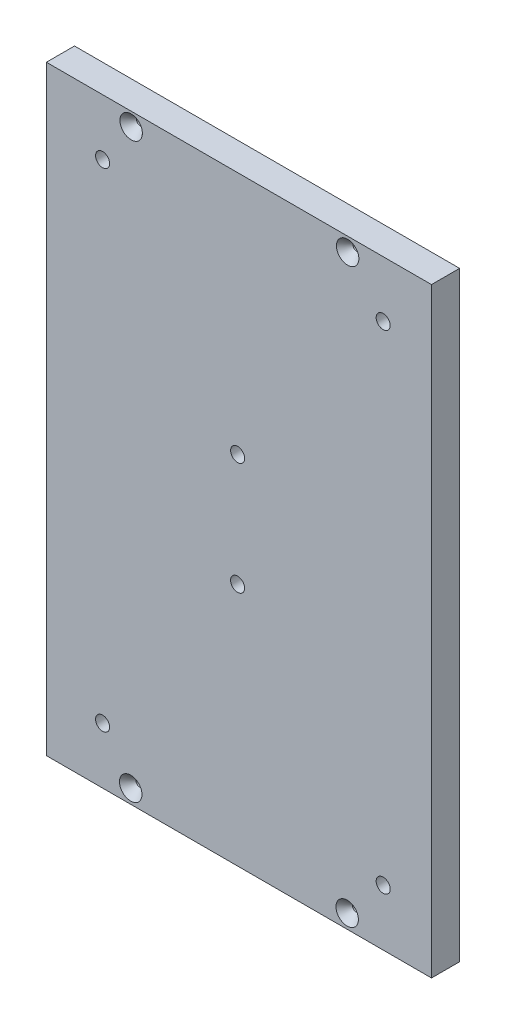
ISO-10303-21;
HEADER;
FILE_DESCRIPTION(('STEP AP214'),'2;1');
FILE_NAME('part.step','',(''),(''),'','','');
FILE_SCHEMA(('AUTOMOTIVE_DESIGN { 1 0 10303 214 1 1 1 1 }'));
ENDSEC;
DATA;
#1=APPLICATION_CONTEXT('core data for automotive mechanical design processes');
#2=APPLICATION_PROTOCOL_DEFINITION('international standard','automotive_design',2000,#1);
#3=PRODUCT_CONTEXT('',#1,'mechanical');
#4=PRODUCT('Part','Part','',(#3));
#5=PRODUCT_RELATED_PRODUCT_CATEGORY('part','',(#4));
#6=PRODUCT_DEFINITION_FORMATION('','',#4);
#7=PRODUCT_DEFINITION_CONTEXT('part definition',#1,'design');
#8=PRODUCT_DEFINITION('design','',#6,#7);
#9=PRODUCT_DEFINITION_SHAPE('','',#8);
#10=(LENGTH_UNIT() NAMED_UNIT(*) SI_UNIT(.MILLI.,.METRE.));
#11=(NAMED_UNIT(*) PLANE_ANGLE_UNIT() SI_UNIT($,.RADIAN.));
#12=(NAMED_UNIT(*) SI_UNIT($,.STERADIAN.) SOLID_ANGLE_UNIT());
#13=UNCERTAINTY_MEASURE_WITH_UNIT(LENGTH_MEASURE(1.E-05),#10,'distance_accuracy_value','');
#14=(GEOMETRIC_REPRESENTATION_CONTEXT(3) GLOBAL_UNCERTAINTY_ASSIGNED_CONTEXT((#13)) GLOBAL_UNIT_ASSIGNED_CONTEXT((#10,
#11,#12)) REPRESENTATION_CONTEXT('',''));
#15=CARTESIAN_POINT('',(0.,0.,0.));
#16=DIRECTION('',(0.,0.,1.));
#17=DIRECTION('',(1.,0.,0.));
#18=AXIS2_PLACEMENT_3D('',#15,#16,#17);
#19=CARTESIAN_POINT('',(125.242491642911,0.,12.7));
#20=DIRECTION('',(1.,0.,0.));
#21=DIRECTION('',(0.,0.,-1.));
#22=AXIS2_PLACEMENT_3D('',#19,#20,#21);
#23=PLANE('',#22);
#24=DIRECTION('',(0.,-1.,0.));
#25=VECTOR('',#24,1.);
#26=CARTESIAN_POINT('',(125.242491642911,0.,0.));
#27=LINE('',#26,#25);
#28=CARTESIAN_POINT('',(125.242491642911,271.365530146065,0.));
#29=VERTEX_POINT('',#28);
#30=CARTESIAN_POINT('',(125.242491642911,0.,0.));
#31=VERTEX_POINT('',#30);
#32=EDGE_CURVE('E100',#29,#31,#27,.T.);
#33=ORIENTED_EDGE('',*,*,#32,.T.);
#34=DIRECTION('',(0.,0.,-1.));
#35=VECTOR('',#34,1.);
#36=CARTESIAN_POINT('',(125.242491642911,0.,12.7));
#37=LINE('',#36,#35);
#38=CARTESIAN_POINT('',(125.242491642911,0.,12.7));
#39=VERTEX_POINT('',#38);
#40=EDGE_CURVE('E11',#39,#31,#37,.T.);
#41=ORIENTED_EDGE('',*,*,#40,.F.);
#42=DIRECTION('',(0.,-1.,0.));
#43=VECTOR('',#42,1.);
#44=CARTESIAN_POINT('',(125.242491642911,0.,12.7));
#45=LINE('',#44,#43);
#46=CARTESIAN_POINT('',(125.242491642911,271.365530146065,12.7));
#47=VERTEX_POINT('',#46);
#48=EDGE_CURVE('E87',#47,#39,#45,.T.);
#49=ORIENTED_EDGE('',*,*,#48,.F.);
#50=DIRECTION('',(0.,0.,-1.));
#51=VECTOR('',#50,1.);
#52=CARTESIAN_POINT('',(125.242491642911,271.365530146065,12.7));
#53=LINE('',#52,#51);
#54=EDGE_CURVE('E96',#47,#29,#53,.T.);
#55=ORIENTED_EDGE('',*,*,#54,.T.);
#56=EDGE_LOOP('',(#33,#41,#49,#55));
#57=FACE_BOUND('',#56,.T.);
#58=ADVANCED_FACE('F34',(#57),#23,.F.);
#59=CARTESIAN_POINT('',(125.242491642911,0.,12.7));
#60=DIRECTION('',(0.,1.,0.));
#61=DIRECTION('',(0.,0.,1.));
#62=AXIS2_PLACEMENT_3D('',#59,#60,#61);
#63=PLANE('',#62);
#64=DIRECTION('',(1.,0.,0.));
#65=VECTOR('',#64,1.);
#66=CARTESIAN_POINT('',(125.242491642911,0.,0.));
#67=LINE('',#66,#65);
#68=CARTESIAN_POINT('',(299.263797608764,0.,0.));
#69=VERTEX_POINT('',#68);
#70=EDGE_CURVE('E91',#31,#69,#67,.T.);
#71=ORIENTED_EDGE('',*,*,#70,.T.);
#72=DIRECTION('',(0.,0.,-1.));
#73=VECTOR('',#72,1.);
#74=CARTESIAN_POINT('',(299.263797608764,0.,12.7));
#75=LINE('',#74,#73);
#76=CARTESIAN_POINT('',(299.263797608764,0.,12.7));
#77=VERTEX_POINT('',#76);
#78=EDGE_CURVE('E43',#77,#69,#75,.T.);
#79=ORIENTED_EDGE('',*,*,#78,.F.);
#80=DIRECTION('',(1.,0.,0.));
#81=VECTOR('',#80,1.);
#82=CARTESIAN_POINT('',(125.242491642911,0.,12.7));
#83=LINE('',#82,#81);
#84=EDGE_CURVE('E82',#39,#77,#83,.T.);
#85=ORIENTED_EDGE('',*,*,#84,.F.);
#86=ORIENTED_EDGE('',*,*,#40,.T.);
#87=EDGE_LOOP('',(#71,#79,#85,#86));
#88=FACE_BOUND('',#87,.T.);
#89=ADVANCED_FACE('F90',(#88),#63,.F.);
#90=CARTESIAN_POINT('',(299.263797608764,0.,12.7));
#91=DIRECTION('',(-1.,0.,0.));
#92=DIRECTION('',(0.,-1.,0.));
#93=AXIS2_PLACEMENT_3D('',#90,#91,#92);
#94=PLANE('',#93);
#95=DIRECTION('',(0.,1.,0.));
#96=VECTOR('',#95,1.);
#97=CARTESIAN_POINT('',(299.263797608764,0.,0.));
#98=LINE('',#97,#96);
#99=CARTESIAN_POINT('',(299.263797608764,271.365530146065,0.));
#100=VERTEX_POINT('',#99);
#101=EDGE_CURVE('E69',#69,#100,#98,.T.);
#102=ORIENTED_EDGE('',*,*,#101,.T.);
#103=DIRECTION('',(0.,0.,-1.));
#104=VECTOR('',#103,1.);
#105=CARTESIAN_POINT('',(299.263797608764,271.365530146065,12.7));
#106=LINE('',#105,#104);
#107=CARTESIAN_POINT('',(299.263797608764,271.365530146065,12.7));
#108=VERTEX_POINT('',#107);
#109=EDGE_CURVE('E92',#108,#100,#106,.T.);
#110=ORIENTED_EDGE('',*,*,#109,.F.);
#111=DIRECTION('',(0.,1.,0.));
#112=VECTOR('',#111,1.);
#113=CARTESIAN_POINT('',(299.263797608764,0.,12.7));
#114=LINE('',#113,#112);
#115=EDGE_CURVE('E85',#77,#108,#114,.T.);
#116=ORIENTED_EDGE('',*,*,#115,.F.);
#117=ORIENTED_EDGE('',*,*,#78,.T.);
#118=EDGE_LOOP('',(#102,#110,#116,#117));
#119=FACE_BOUND('',#118,.T.);
#120=ADVANCED_FACE('F94',(#119),#94,.F.);
#121=CARTESIAN_POINT('',(125.242491642911,271.365530146065,12.7));
#122=DIRECTION('',(0.,-1.,0.));
#123=DIRECTION('',(1.,0.,0.));
#124=AXIS2_PLACEMENT_3D('',#121,#122,#123);
#125=PLANE('',#124);
#126=DIRECTION('',(-1.,0.,0.));
#127=VECTOR('',#126,1.);
#128=CARTESIAN_POINT('',(125.242491642911,271.365530146065,0.));
#129=LINE('',#128,#127);
#130=EDGE_CURVE('E75',#100,#29,#129,.T.);
#131=ORIENTED_EDGE('',*,*,#130,.T.);
#132=ORIENTED_EDGE('',*,*,#54,.F.);
#133=DIRECTION('',(-1.,0.,0.));
#134=VECTOR('',#133,1.);
#135=CARTESIAN_POINT('',(125.242491642911,271.365530146065,12.7));
#136=LINE('',#135,#134);
#137=EDGE_CURVE('E52',#108,#47,#136,.T.);
#138=ORIENTED_EDGE('',*,*,#137,.F.);
#139=ORIENTED_EDGE('',*,*,#109,.T.);
#140=EDGE_LOOP('',(#131,#132,#138,#139));
#141=FACE_BOUND('',#140,.T.);
#142=ADVANCED_FACE('F191',(#141),#125,.F.);
#143=CARTESIAN_POINT('',(0.,0.,12.7));
#144=DIRECTION('',(0.,0.,-1.));
#145=DIRECTION('',(-1.,0.,0.));
#146=AXIS2_PLACEMENT_3D('',#143,#144,#145);
#147=PLANE('',#146);
#148=CARTESIAN_POINT('',(163.342491642911,6.35000000000024,12.7000000000335));
#149=DIRECTION('',(0.,0.,1.));
#150=DIRECTION('',(1.,0.,0.));
#151=AXIS2_PLACEMENT_3D('',#148,#149,#150);
#152=CIRCLE('',#151,5.08);
#153=CARTESIAN_POINT('',(168.422491642911,6.35000000000024,12.7000000000335));
#154=VERTEX_POINT('',#153);
#155=EDGE_CURVE('E371',#154,#154,#152,.T.);
#156=ORIENTED_EDGE('',*,*,#155,.F.);
#157=EDGE_LOOP('',(#156));
#158=FACE_BOUND('',#157,.T.);
#159=CARTESIAN_POINT('',(261.163797608764,6.35000000000027,12.7000000000335));
#160=DIRECTION('',(0.,0.,1.));
#161=DIRECTION('',(1.,0.,0.));
#162=AXIS2_PLACEMENT_3D('',#159,#160,#161);
#163=CIRCLE('',#162,5.08000000000003);
#164=CARTESIAN_POINT('',(266.243797608764,6.35000000000027,12.7000000000335));
#165=VERTEX_POINT('',#164);
#166=EDGE_CURVE('E127',#165,#165,#163,.T.);
#167=ORIENTED_EDGE('',*,*,#166,.F.);
#168=EDGE_LOOP('',(#167));
#169=FACE_BOUND('',#168,.T.);
#170=CARTESIAN_POINT('',(163.542078970857,265.224961390961,12.7000000000335));
#171=DIRECTION('',(0.,0.,1.));
#172=DIRECTION('',(1.,0.,0.));
#173=AXIS2_PLACEMENT_3D('',#170,#171,#172);
#174=CIRCLE('',#173,5.08);
#175=CARTESIAN_POINT('',(168.622078970857,265.224961390961,12.7000000000335));
#176=VERTEX_POINT('',#175);
#177=EDGE_CURVE('E120',#176,#176,#174,.T.);
#178=ORIENTED_EDGE('',*,*,#177,.F.);
#179=EDGE_LOOP('',(#178));
#180=FACE_BOUND('',#179,.T.);
#181=CARTESIAN_POINT('',(261.363268644928,265.074125007527,12.7000000000335));
#182=DIRECTION('',(0.,0.,1.));
#183=DIRECTION('',(1.,0.,0.));
#184=AXIS2_PLACEMENT_3D('',#181,#182,#183);
#185=CIRCLE('',#184,5.08000000000003);
#186=CARTESIAN_POINT('',(266.443268644928,265.074125007527,12.7000000000335));
#187=VERTEX_POINT('',#186);
#188=EDGE_CURVE('E116',#187,#187,#185,.T.);
#189=ORIENTED_EDGE('',*,*,#188,.F.);
#190=EDGE_LOOP('',(#189));
#191=FACE_BOUND('',#190,.T.);
#192=CARTESIAN_POINT('',(277.426568304688,245.965530146065,12.7));
#193=DIRECTION('',(0.,0.,-1.));
#194=DIRECTION('',(-1.,0.,0.));
#195=AXIS2_PLACEMENT_3D('',#192,#193,#194);
#196=CIRCLE('',#195,3.17499999999998);
#197=CARTESIAN_POINT('',(274.251568304688,245.965530146065,12.7));
#198=VERTEX_POINT('',#197);
#199=EDGE_CURVE('E143',#198,#198,#196,.T.);
#200=ORIENTED_EDGE('',*,*,#199,.T.);
#201=EDGE_LOOP('',(#200));
#202=FACE_BOUND('',#201,.T.);
#203=CARTESIAN_POINT('',(211.65326417621,161.082765073034,12.7));
#204=DIRECTION('',(0.,0.,-1.));
#205=DIRECTION('',(-1.,0.,0.));
#206=AXIS2_PLACEMENT_3D('',#203,#204,#205);
#207=CIRCLE('',#206,3.17499999999998);
#208=CARTESIAN_POINT('',(208.47826417621,161.082765073034,12.7));
#209=VERTEX_POINT('',#208);
#210=EDGE_CURVE('E149',#209,#209,#207,.T.);
#211=ORIENTED_EDGE('',*,*,#210,.T.);
#212=EDGE_LOOP('',(#211));
#213=FACE_BOUND('',#212,.T.);
#214=CARTESIAN_POINT('',(150.642491642911,245.965530146065,12.7));
#215=DIRECTION('',(0.,0.,-1.));
#216=DIRECTION('',(-1.,0.,0.));
#217=AXIS2_PLACEMENT_3D('',#214,#215,#216);
#218=CIRCLE('',#217,3.17499999999998);
#219=CARTESIAN_POINT('',(147.467491642911,245.965530146065,12.7));
#220=VERTEX_POINT('',#219);
#221=EDGE_CURVE('E155',#220,#220,#218,.T.);
#222=ORIENTED_EDGE('',*,*,#221,.T.);
#223=EDGE_LOOP('',(#222));
#224=FACE_BOUND('',#223,.T.);
#225=CARTESIAN_POINT('',(211.653264176209,110.282765073031,12.7));
#226=DIRECTION('',(0.,0.,-1.));
#227=DIRECTION('',(-1.,0.,0.));
#228=AXIS2_PLACEMENT_3D('',#225,#226,#227);
#229=CIRCLE('',#228,3.17499999999998);
#230=CARTESIAN_POINT('',(208.478264176209,110.282765073031,12.7));
#231=VERTEX_POINT('',#230);
#232=EDGE_CURVE('E161',#231,#231,#229,.T.);
#233=ORIENTED_EDGE('',*,*,#232,.T.);
#234=EDGE_LOOP('',(#233));
#235=FACE_BOUND('',#234,.T.);
#236=CARTESIAN_POINT('',(277.426568304688,25.4000000000031,12.7));
#237=DIRECTION('',(0.,0.,-1.));
#238=DIRECTION('',(-1.,0.,0.));
#239=AXIS2_PLACEMENT_3D('',#236,#237,#238);
#240=CIRCLE('',#239,3.17499999999998);
#241=CARTESIAN_POINT('',(274.251568304688,25.4000000000031,12.7));
#242=VERTEX_POINT('',#241);
#243=EDGE_CURVE('E167',#242,#242,#240,.T.);
#244=ORIENTED_EDGE('',*,*,#243,.T.);
#245=EDGE_LOOP('',(#244));
#246=FACE_BOUND('',#245,.T.);
#247=CARTESIAN_POINT('',(150.642491642911,25.4000000000031,12.7));
#248=DIRECTION('',(0.,0.,-1.));
#249=DIRECTION('',(-1.,0.,0.));
#250=AXIS2_PLACEMENT_3D('',#247,#248,#249);
#251=CIRCLE('',#250,3.17499999999998);
#252=CARTESIAN_POINT('',(147.467491642911,25.4000000000031,12.7));
#253=VERTEX_POINT('',#252);
#254=EDGE_CURVE('E103',#253,#253,#251,.T.);
#255=ORIENTED_EDGE('',*,*,#254,.T.);
#256=EDGE_LOOP('',(#255));
#257=FACE_BOUND('',#256,.T.);
#258=ORIENTED_EDGE('',*,*,#48,.T.);
#259=ORIENTED_EDGE('',*,*,#84,.T.);
#260=ORIENTED_EDGE('',*,*,#115,.T.);
#261=ORIENTED_EDGE('',*,*,#137,.T.);
#262=EDGE_LOOP('',(#258,#259,#260,#261));
#263=FACE_BOUND('',#262,.T.);
#264=ADVANCED_FACE('F83',(#158,#169,#180,#191,#202,#213,#224,#235,#246,#257,#263),#147,.F.);
#265=CARTESIAN_POINT('',(0.,0.,0.));
#266=DIRECTION('',(0.,0.,-1.));
#267=DIRECTION('',(-1.,0.,0.));
#268=AXIS2_PLACEMENT_3D('',#265,#266,#267);
#269=PLANE('',#268);
#270=CARTESIAN_POINT('',(163.342491642911,6.35000000000024,0.));
#271=DIRECTION('',(0.,0.,-1.));
#272=DIRECTION('',(-1.,0.,0.));
#273=AXIS2_PLACEMENT_3D('',#270,#271,#272);
#274=CIRCLE('',#273,1.58749999999999);
#275=CARTESIAN_POINT('',(161.754991642911,6.35000000000024,0.));
#276=VERTEX_POINT('',#275);
#277=EDGE_CURVE('E37',#276,#276,#274,.T.);
#278=ORIENTED_EDGE('',*,*,#277,.F.);
#279=EDGE_LOOP('',(#278));
#280=FACE_BOUND('',#279,.T.);
#281=CARTESIAN_POINT('',(261.163797608764,6.35000000000027,0.));
#282=DIRECTION('',(0.,0.,-1.));
#283=DIRECTION('',(-1.,0.,0.));
#284=AXIS2_PLACEMENT_3D('',#281,#282,#283);
#285=CIRCLE('',#284,1.58750000000002);
#286=CARTESIAN_POINT('',(259.576297608764,6.35000000000027,0.));
#287=VERTEX_POINT('',#286);
#288=EDGE_CURVE('E118',#287,#287,#285,.T.);
#289=ORIENTED_EDGE('',*,*,#288,.F.);
#290=EDGE_LOOP('',(#289));
#291=FACE_BOUND('',#290,.T.);
#292=CARTESIAN_POINT('',(163.542078970857,265.224961390961,0.));
#293=DIRECTION('',(0.,0.,-1.));
#294=DIRECTION('',(-1.,0.,0.));
#295=AXIS2_PLACEMENT_3D('',#292,#293,#294);
#296=CIRCLE('',#295,1.58749999999999);
#297=CARTESIAN_POINT('',(161.954578970857,265.224961390961,0.));
#298=VERTEX_POINT('',#297);
#299=EDGE_CURVE('E114',#298,#298,#296,.T.);
#300=ORIENTED_EDGE('',*,*,#299,.F.);
#301=EDGE_LOOP('',(#300));
#302=FACE_BOUND('',#301,.T.);
#303=CARTESIAN_POINT('',(261.363268644928,265.074125007527,0.));
#304=DIRECTION('',(0.,0.,-1.));
#305=DIRECTION('',(-1.,0.,0.));
#306=AXIS2_PLACEMENT_3D('',#303,#304,#305);
#307=CIRCLE('',#306,1.58750000000002);
#308=CARTESIAN_POINT('',(259.775768644928,265.074125007527,0.));
#309=VERTEX_POINT('',#308);
#310=EDGE_CURVE('E109',#309,#309,#307,.T.);
#311=ORIENTED_EDGE('',*,*,#310,.F.);
#312=EDGE_LOOP('',(#311));
#313=FACE_BOUND('',#312,.T.);
#314=CARTESIAN_POINT('',(277.426568304688,245.965530146065,0.));
#315=DIRECTION('',(0.,0.,-1.));
#316=DIRECTION('',(-1.,0.,0.));
#317=AXIS2_PLACEMENT_3D('',#314,#315,#316);
#318=CIRCLE('',#317,3.17499999999998);
#319=CARTESIAN_POINT('',(274.251568304688,245.965530146065,0.));
#320=VERTEX_POINT('',#319);
#321=EDGE_CURVE('E112',#320,#320,#318,.T.);
#322=ORIENTED_EDGE('',*,*,#321,.F.);
#323=EDGE_LOOP('',(#322));
#324=FACE_BOUND('',#323,.T.);
#325=CARTESIAN_POINT('',(211.65326417621,161.082765073034,0.));
#326=DIRECTION('',(0.,0.,-1.));
#327=DIRECTION('',(-1.,0.,0.));
#328=AXIS2_PLACEMENT_3D('',#325,#326,#327);
#329=CIRCLE('',#328,3.17499999999998);
#330=CARTESIAN_POINT('',(208.47826417621,161.082765073034,0.));
#331=VERTEX_POINT('',#330);
#332=EDGE_CURVE('E146',#331,#331,#329,.T.);
#333=ORIENTED_EDGE('',*,*,#332,.F.);
#334=EDGE_LOOP('',(#333));
#335=FACE_BOUND('',#334,.T.);
#336=CARTESIAN_POINT('',(150.642491642911,245.965530146065,0.));
#337=DIRECTION('',(0.,0.,-1.));
#338=DIRECTION('',(-1.,0.,0.));
#339=AXIS2_PLACEMENT_3D('',#336,#337,#338);
#340=CIRCLE('',#339,3.17499999999998);
#341=CARTESIAN_POINT('',(147.467491642911,245.965530146065,0.));
#342=VERTEX_POINT('',#341);
#343=EDGE_CURVE('E152',#342,#342,#340,.T.);
#344=ORIENTED_EDGE('',*,*,#343,.F.);
#345=EDGE_LOOP('',(#344));
#346=FACE_BOUND('',#345,.T.);
#347=CARTESIAN_POINT('',(211.653264176209,110.282765073031,0.));
#348=DIRECTION('',(0.,0.,-1.));
#349=DIRECTION('',(-1.,0.,0.));
#350=AXIS2_PLACEMENT_3D('',#347,#348,#349);
#351=CIRCLE('',#350,3.17499999999998);
#352=CARTESIAN_POINT('',(208.478264176209,110.282765073031,0.));
#353=VERTEX_POINT('',#352);
#354=EDGE_CURVE('E158',#353,#353,#351,.T.);
#355=ORIENTED_EDGE('',*,*,#354,.F.);
#356=EDGE_LOOP('',(#355));
#357=FACE_BOUND('',#356,.T.);
#358=CARTESIAN_POINT('',(277.426568304688,25.4000000000031,0.));
#359=DIRECTION('',(0.,0.,-1.));
#360=DIRECTION('',(-1.,0.,0.));
#361=AXIS2_PLACEMENT_3D('',#358,#359,#360);
#362=CIRCLE('',#361,3.17499999999998);
#363=CARTESIAN_POINT('',(274.251568304688,25.4000000000031,0.));
#364=VERTEX_POINT('',#363);
#365=EDGE_CURVE('E164',#364,#364,#362,.T.);
#366=ORIENTED_EDGE('',*,*,#365,.F.);
#367=EDGE_LOOP('',(#366));
#368=FACE_BOUND('',#367,.T.);
#369=CARTESIAN_POINT('',(150.642491642911,25.4000000000031,0.));
#370=DIRECTION('',(0.,0.,-1.));
#371=DIRECTION('',(-1.,0.,0.));
#372=AXIS2_PLACEMENT_3D('',#369,#370,#371);
#373=CIRCLE('',#372,3.17499999999998);
#374=CARTESIAN_POINT('',(147.467491642911,25.4000000000031,0.));
#375=VERTEX_POINT('',#374);
#376=EDGE_CURVE('E170',#375,#375,#373,.T.);
#377=ORIENTED_EDGE('',*,*,#376,.F.);
#378=EDGE_LOOP('',(#377));
#379=FACE_BOUND('',#378,.T.);
#380=ORIENTED_EDGE('',*,*,#32,.F.);
#381=ORIENTED_EDGE('',*,*,#130,.F.);
#382=ORIENTED_EDGE('',*,*,#101,.F.);
#383=ORIENTED_EDGE('',*,*,#70,.F.);
#384=EDGE_LOOP('',(#380,#381,#382,#383));
#385=FACE_BOUND('',#384,.T.);
#386=ADVANCED_FACE('F181',(#280,#291,#302,#313,#324,#335,#346,#357,#368,#379,#385),#269,.T.);
#387=CARTESIAN_POINT('',(150.642491642911,25.4000000000031,0.));
#388=DIRECTION('',(0.,0.,-1.));
#389=DIRECTION('',(-1.,0.,0.));
#390=AXIS2_PLACEMENT_3D('',#387,#388,#389);
#391=CYLINDRICAL_SURFACE('',#390,3.17499999999998);
#392=ORIENTED_EDGE('',*,*,#254,.F.);
#393=EDGE_LOOP('',(#392));
#394=FACE_BOUND('',#393,.T.);
#395=ORIENTED_EDGE('',*,*,#376,.T.);
#396=EDGE_LOOP('',(#395));
#397=FACE_BOUND('',#396,.T.);
#398=ADVANCED_FACE('F177',(#394,#397),#391,.F.);
#399=CARTESIAN_POINT('',(277.426568304688,25.4000000000031,0.));
#400=DIRECTION('',(0.,0.,-1.));
#401=DIRECTION('',(-1.,0.,0.));
#402=AXIS2_PLACEMENT_3D('',#399,#400,#401);
#403=CYLINDRICAL_SURFACE('',#402,3.17499999999998);
#404=ORIENTED_EDGE('',*,*,#243,.F.);
#405=EDGE_LOOP('',(#404));
#406=FACE_BOUND('',#405,.T.);
#407=ORIENTED_EDGE('',*,*,#365,.T.);
#408=EDGE_LOOP('',(#407));
#409=FACE_BOUND('',#408,.T.);
#410=ADVANCED_FACE('F180',(#406,#409),#403,.F.);
#411=CARTESIAN_POINT('',(211.653264176209,110.282765073031,0.));
#412=DIRECTION('',(0.,0.,-1.));
#413=DIRECTION('',(-1.,0.,0.));
#414=AXIS2_PLACEMENT_3D('',#411,#412,#413);
#415=CYLINDRICAL_SURFACE('',#414,3.17499999999998);
#416=ORIENTED_EDGE('',*,*,#232,.F.);
#417=EDGE_LOOP('',(#416));
#418=FACE_BOUND('',#417,.T.);
#419=ORIENTED_EDGE('',*,*,#354,.T.);
#420=EDGE_LOOP('',(#419));
#421=FACE_BOUND('',#420,.T.);
#422=ADVANCED_FACE('F232',(#418,#421),#415,.F.);
#423=CARTESIAN_POINT('',(150.642491642911,245.965530146065,0.));
#424=DIRECTION('',(0.,0.,-1.));
#425=DIRECTION('',(-1.,0.,0.));
#426=AXIS2_PLACEMENT_3D('',#423,#424,#425);
#427=CYLINDRICAL_SURFACE('',#426,3.17499999999998);
#428=ORIENTED_EDGE('',*,*,#221,.F.);
#429=EDGE_LOOP('',(#428));
#430=FACE_BOUND('',#429,.T.);
#431=ORIENTED_EDGE('',*,*,#343,.T.);
#432=EDGE_LOOP('',(#431));
#433=FACE_BOUND('',#432,.T.);
#434=ADVANCED_FACE('F242',(#430,#433),#427,.F.);
#435=CARTESIAN_POINT('',(211.65326417621,161.082765073034,0.));
#436=DIRECTION('',(0.,0.,-1.));
#437=DIRECTION('',(-1.,0.,0.));
#438=AXIS2_PLACEMENT_3D('',#435,#436,#437);
#439=CYLINDRICAL_SURFACE('',#438,3.17499999999998);
#440=ORIENTED_EDGE('',*,*,#210,.F.);
#441=EDGE_LOOP('',(#440));
#442=FACE_BOUND('',#441,.T.);
#443=ORIENTED_EDGE('',*,*,#332,.T.);
#444=EDGE_LOOP('',(#443));
#445=FACE_BOUND('',#444,.T.);
#446=ADVANCED_FACE('F252',(#442,#445),#439,.F.);
#447=CARTESIAN_POINT('',(277.426568304688,245.965530146065,0.));
#448=DIRECTION('',(0.,0.,-1.));
#449=DIRECTION('',(-1.,0.,0.));
#450=AXIS2_PLACEMENT_3D('',#447,#448,#449);
#451=CYLINDRICAL_SURFACE('',#450,3.17499999999998);
#452=ORIENTED_EDGE('',*,*,#199,.F.);
#453=EDGE_LOOP('',(#452));
#454=FACE_BOUND('',#453,.T.);
#455=ORIENTED_EDGE('',*,*,#321,.T.);
#456=EDGE_LOOP('',(#455));
#457=FACE_BOUND('',#456,.T.);
#458=ADVANCED_FACE('F262',(#454,#457),#451,.F.);
#459=CARTESIAN_POINT('',(261.363268644928,265.074125007527,12.7000000000335));
#460=DIRECTION('',(0.,0.,1.));
#461=DIRECTION('',(1.,0.,0.));
#462=AXIS2_PLACEMENT_3D('',#459,#460,#461);
#463=CYLINDRICAL_SURFACE('',#462,1.58750000000002);
#464=ORIENTED_EDGE('',*,*,#310,.T.);
#465=EDGE_LOOP('',(#464));
#466=FACE_BOUND('',#465,.T.);
#467=CARTESIAN_POINT('',(261.363268644928,265.074125007527,8.6823383378141));
#468=DIRECTION('',(0.,0.,1.));
#469=DIRECTION('',(1.,0.,0.));
#470=AXIS2_PLACEMENT_3D('',#467,#468,#469);
#471=CIRCLE('',#470,1.58750000000002);
#472=CARTESIAN_POINT('',(262.950768644928,265.074125007527,8.6823383378141));
#473=VERTEX_POINT('',#472);
#474=EDGE_CURVE('E113',#473,#473,#471,.T.);
#475=ORIENTED_EDGE('',*,*,#474,.T.);
#476=EDGE_LOOP('',(#475));
#477=FACE_BOUND('',#476,.T.);
#478=ADVANCED_FACE('F272',(#466,#477),#463,.F.);
#479=CARTESIAN_POINT('',(261.363268644928,265.074125007527,12.7000000000335));
#480=DIRECTION('',(0.,0.,1.));
#481=DIRECTION('',(1.,0.,0.));
#482=AXIS2_PLACEMENT_3D('',#479,#480,#481);
#483=CONICAL_SURFACE('',#482,5.08000000000003,0.715584993317678);
#484=CARTESIAN_POINT('',(262.950768644928,265.074125007527,8.6823383378141));
#485=CARTESIAN_POINT('',(262.987148853261,265.074125007527,8.72418898012888));
#486=CARTESIAN_POINT('',(263.023529061595,265.074125007527,8.76603962244367));
#487=CARTESIAN_POINT('',(263.096289478261,265.074125007527,8.84974090707324));
#488=CARTESIAN_POINT('',(263.132669686595,265.074125007527,8.89159154938802));
#489=CARTESIAN_POINT('',(263.205430103261,265.074125007527,8.97529283401759));
#490=CARTESIAN_POINT('',(263.241810311595,265.074125007527,9.01714347633238));
#491=CARTESIAN_POINT('',(263.314570728261,265.074125007527,9.10084476096195));
#492=CARTESIAN_POINT('',(263.350950936595,265.074125007527,9.14269540327673));
#493=CARTESIAN_POINT('',(263.423711353261,265.074125007527,9.2263966879063));
#494=CARTESIAN_POINT('',(263.460091561595,265.074125007527,9.26824733022108));
#495=CARTESIAN_POINT('',(263.532851978261,265.074125007527,9.35194861485066));
#496=CARTESIAN_POINT('',(263.569232186595,265.074125007527,9.39379925716544));
#497=CARTESIAN_POINT('',(263.641992603261,265.074125007527,9.47750054179501));
#498=CARTESIAN_POINT('',(263.678372811595,265.074125007527,9.51935118410979));
#499=CARTESIAN_POINT('',(263.751133228261,265.074125007527,9.60305246873936));
#500=CARTESIAN_POINT('',(263.787513436595,265.074125007527,9.64490311105415));
#501=CARTESIAN_POINT('',(263.860273853261,265.074125007527,9.72860439568373));
#502=CARTESIAN_POINT('',(263.896654061595,265.074125007527,9.77045503799851));
#503=CARTESIAN_POINT('',(263.969414478261,265.074125007527,9.85415632262808));
#504=CARTESIAN_POINT('',(264.005794686595,265.074125007527,9.89600696494286));
#505=CARTESIAN_POINT('',(264.078555103261,265.074125007527,9.97970824957243));
#506=CARTESIAN_POINT('',(264.114935311595,265.074125007527,10.0215588918872));
#507=CARTESIAN_POINT('',(264.187695728261,265.074125007527,10.1052601765168));
#508=CARTESIAN_POINT('',(264.224075936595,265.074125007527,10.1471108188316));
#509=CARTESIAN_POINT('',(264.296836353261,265.074125007527,10.2308121034611));
#510=CARTESIAN_POINT('',(264.333216561595,265.074125007527,10.2726627457759));
#511=CARTESIAN_POINT('',(264.405976978261,265.074125007527,10.3563640304055));
#512=CARTESIAN_POINT('',(264.442357186595,265.074125007527,10.3982146727203));
#513=CARTESIAN_POINT('',(264.515117603261,265.074125007527,10.4819159573499));
#514=CARTESIAN_POINT('',(264.551497811595,265.074125007527,10.5237665996646));
#515=CARTESIAN_POINT('',(264.624258228261,265.074125007527,10.6074678842942));
#516=CARTESIAN_POINT('',(264.660638436595,265.074125007527,10.649318526609));
#517=CARTESIAN_POINT('',(264.733398853261,265.074125007527,10.7330198112386));
#518=CARTESIAN_POINT('',(264.769779061595,265.074125007527,10.7748704535533));
#519=CARTESIAN_POINT('',(264.842539478261,265.074125007527,10.8585717381829));
#520=CARTESIAN_POINT('',(264.878919686595,265.074125007527,10.9004223804977));
#521=CARTESIAN_POINT('',(264.951680103261,265.074125007527,10.9841236651273));
#522=CARTESIAN_POINT('',(264.988060311595,265.074125007527,11.0259743074421));
#523=CARTESIAN_POINT('',(265.060820728261,265.074125007527,11.1096755920716));
#524=CARTESIAN_POINT('',(265.097200936595,265.074125007527,11.1515262343864));
#525=CARTESIAN_POINT('',(265.169961353261,265.074125007527,11.235227519016));
#526=CARTESIAN_POINT('',(265.206341561595,265.074125007527,11.2770781613308));
#527=CARTESIAN_POINT('',(265.279101978261,265.074125007527,11.3607794459603));
#528=CARTESIAN_POINT('',(265.315482186595,265.074125007527,11.4026300882751));
#529=CARTESIAN_POINT('',(265.388242603261,265.074125007527,11.4863313729047));
#530=CARTESIAN_POINT('',(265.424622811595,265.074125007527,11.5281820152195));
#531=CARTESIAN_POINT('',(265.497383228261,265.074125007527,11.611883299849));
#532=CARTESIAN_POINT('',(265.533763436595,265.074125007527,11.6537339421638));
#533=CARTESIAN_POINT('',(265.606523853261,265.074125007527,11.7374352267934));
#534=CARTESIAN_POINT('',(265.642904061595,265.074125007527,11.7792858691082));
#535=CARTESIAN_POINT('',(265.715664478261,265.074125007527,11.8629871537378));
#536=CARTESIAN_POINT('',(265.752044686595,265.074125007527,11.9048377960525));
#537=CARTESIAN_POINT('',(265.824805103261,265.074125007527,11.9885390806821));
#538=CARTESIAN_POINT('',(265.861185311595,265.074125007527,12.0303897229969));
#539=CARTESIAN_POINT('',(265.933945728261,265.074125007527,12.1140910076265));
#540=CARTESIAN_POINT('',(265.970325936595,265.074125007527,12.1559416499413));
#541=CARTESIAN_POINT('',(266.043086353261,265.074125007527,12.2396429345708));
#542=CARTESIAN_POINT('',(266.079466561595,265.074125007527,12.2814935768856));
#543=CARTESIAN_POINT('',(266.152226978261,265.074125007527,12.3651948615152));
#544=CARTESIAN_POINT('',(266.188607186595,265.074125007527,12.40704550383));
#545=CARTESIAN_POINT('',(266.261367603261,265.074125007527,12.4907467884595));
#546=CARTESIAN_POINT('',(266.297747811595,265.074125007527,12.5325974307743));
#547=CARTESIAN_POINT('',(266.370508228261,265.074125007527,12.6162987154039));
#548=CARTESIAN_POINT('',(266.406888436595,265.074125007527,12.6581493577187));
#549=CARTESIAN_POINT('',(266.443268644928,265.074125007527,12.7000000000335));
#550=B_SPLINE_CURVE_WITH_KNOTS('',3,(#484,#485,#486,#487,#488,#489,#490,#491,#492,#493,#494,
#495,#496,#497,#498,#499,#500,#501,#502,#503,#504,#505,#506,#507,#508,#509,#510,#511,#512,#513,
#514,#515,#516,#517,#518,#519,#520,#521,#522,#523,#524,#525,#526,#527,#528,#529,#530,#531,#532,
#533,#534,#535,#536,#537,#538,#539,#540,#541,#542,#543,#544,#545,#546,#547,#548,#549),
.UNSPECIFIED.,.F.,.F.,(4,2,2,2,2,2,2,2,2,2,2,2,2,2,2,2,2,2,2,2,2,2,2,2,2,2,2,2,2,2,2,2,4),(0.,
0.166357934541253,0.332715869082508,0.499073803623762,0.665431738165016,0.83178967270627,
0.998147607247524,1.16450554178878,1.33086347632999,1.49722141087125,1.6635793454125,
1.82993727995376,1.99629521449501,2.16265314903627,2.32901108357752,2.49536901811877,
2.66172695266003,2.82808488720128,2.99444282174253,3.16080075628379,3.32715869082504,
3.4935166253663,3.65987455990755,3.8262324944488,3.99259042899002,4.15894836353127,
4.32530629807253,4.49166423261378,4.65802216715504,4.82438010169629,4.99073803623755,
5.1570959707788,5.32345390532005),.UNSPECIFIED.);
#551=EDGE_CURVE('BSEAM292',#473,#187,#550,.T.);
#552=ORIENTED_EDGE('',*,*,#474,.F.);
#553=ORIENTED_EDGE('',*,*,#188,.T.);
#554=ORIENTED_EDGE('',*,*,#551,.T.);
#555=ORIENTED_EDGE('',*,*,#551,.F.);
#556=EDGE_LOOP('',(#552,#554,#553,#555));
#557=FACE_BOUND('',#556,.T.);
#558=ADVANCED_FACE('F292',(#557),#483,.F.);
#559=CARTESIAN_POINT('',(163.542078970857,265.224961390961,12.7000000000335));
#560=DIRECTION('',(0.,0.,1.));
#561=DIRECTION('',(1.,0.,0.));
#562=AXIS2_PLACEMENT_3D('',#559,#560,#561);
#563=CYLINDRICAL_SURFACE('',#562,1.58749999999999);
#564=ORIENTED_EDGE('',*,*,#299,.T.);
#565=EDGE_LOOP('',(#564));
#566=FACE_BOUND('',#565,.T.);
#567=CARTESIAN_POINT('',(163.542078970857,265.224961390961,8.6823383378141));
#568=DIRECTION('',(0.,0.,1.));
#569=DIRECTION('',(1.,0.,0.));
#570=AXIS2_PLACEMENT_3D('',#567,#568,#569);
#571=CIRCLE('',#570,1.58749999999999);
#572=CARTESIAN_POINT('',(165.129578970857,265.224961390961,8.6823383378141));
#573=VERTEX_POINT('',#572);
#574=EDGE_CURVE('E117',#573,#573,#571,.T.);
#575=ORIENTED_EDGE('',*,*,#574,.T.);
#576=EDGE_LOOP('',(#575));
#577=FACE_BOUND('',#576,.T.);
#578=ADVANCED_FACE('F302',(#566,#577),#563,.F.);
#579=CARTESIAN_POINT('',(163.542078970857,265.224961390961,12.7000000000335));
#580=DIRECTION('',(0.,0.,1.));
#581=DIRECTION('',(1.,0.,0.));
#582=AXIS2_PLACEMENT_3D('',#579,#580,#581);
#583=CONICAL_SURFACE('',#582,5.08,0.715584993317678);
#584=CARTESIAN_POINT('',(165.129578970857,265.224961390961,8.6823383378141));
#585=CARTESIAN_POINT('',(165.165959179191,265.224961390961,8.72418898012888));
#586=CARTESIAN_POINT('',(165.202339387524,265.224961390961,8.76603962244366));
#587=CARTESIAN_POINT('',(165.275099804191,265.224961390961,8.84974090707324));
#588=CARTESIAN_POINT('',(165.311480012524,265.224961390961,8.89159154938802));
#589=CARTESIAN_POINT('',(165.384240429191,265.224961390961,8.97529283401759));
#590=CARTESIAN_POINT('',(165.420620637524,265.224961390961,9.01714347633237));
#591=CARTESIAN_POINT('',(165.493381054191,265.224961390961,9.10084476096194));
#592=CARTESIAN_POINT('',(165.529761262524,265.224961390961,9.14269540327673));
#593=CARTESIAN_POINT('',(165.602521679191,265.224961390961,9.2263966879063));
#594=CARTESIAN_POINT('',(165.638901887524,265.224961390961,9.26824733022109));
#595=CARTESIAN_POINT('',(165.711662304191,265.224961390961,9.35194861485066));
#596=CARTESIAN_POINT('',(165.748042512524,265.224961390961,9.39379925716544));
#597=CARTESIAN_POINT('',(165.820802929191,265.224961390961,9.47750054179501));
#598=CARTESIAN_POINT('',(165.857183137524,265.224961390961,9.5193511841098));
#599=CARTESIAN_POINT('',(165.929943554191,265.224961390961,9.60305246873937));
#600=CARTESIAN_POINT('',(165.966323762524,265.224961390961,9.64490311105415));
#601=CARTESIAN_POINT('',(166.039084179191,265.224961390961,9.72860439568372));
#602=CARTESIAN_POINT('',(166.075464387524,265.224961390961,9.77045503799851));
#603=CARTESIAN_POINT('',(166.148224804191,265.224961390961,9.85415632262808));
#604=CARTESIAN_POINT('',(166.184605012524,265.224961390961,9.89600696494286));
#605=CARTESIAN_POINT('',(166.257365429191,265.224961390961,9.97970824957243));
#606=CARTESIAN_POINT('',(166.293745637524,265.224961390961,10.0215588918872));
#607=CARTESIAN_POINT('',(166.366506054191,265.224961390961,10.1052601765168));
#608=CARTESIAN_POINT('',(166.402886262524,265.224961390961,10.1471108188316));
#609=CARTESIAN_POINT('',(166.475646679191,265.224961390961,10.2308121034611));
#610=CARTESIAN_POINT('',(166.512026887524,265.224961390961,10.2726627457759));
#611=CARTESIAN_POINT('',(166.584787304191,265.224961390961,10.3563640304055));
#612=CARTESIAN_POINT('',(166.621167512524,265.224961390961,10.3982146727203));
#613=CARTESIAN_POINT('',(166.693927929191,265.224961390961,10.4819159573499));
#614=CARTESIAN_POINT('',(166.730308137524,265.224961390961,10.5237665996646));
#615=CARTESIAN_POINT('',(166.803068554191,265.224961390961,10.6074678842942));
#616=CARTESIAN_POINT('',(166.839448762524,265.224961390961,10.649318526609));
#617=CARTESIAN_POINT('',(166.912209179191,265.224961390961,10.7330198112386));
#618=CARTESIAN_POINT('',(166.948589387524,265.224961390961,10.7748704535533));
#619=CARTESIAN_POINT('',(167.021349804191,265.224961390961,10.8585717381829));
#620=CARTESIAN_POINT('',(167.057730012524,265.224961390961,10.9004223804977));
#621=CARTESIAN_POINT('',(167.130490429191,265.224961390961,10.9841236651273));
#622=CARTESIAN_POINT('',(167.166870637524,265.224961390961,11.0259743074421));
#623=CARTESIAN_POINT('',(167.239631054191,265.224961390961,11.1096755920716));
#624=CARTESIAN_POINT('',(167.276011262524,265.224961390961,11.1515262343864));
#625=CARTESIAN_POINT('',(167.348771679191,265.224961390961,11.235227519016));
#626=CARTESIAN_POINT('',(167.385151887524,265.224961390961,11.2770781613308));
#627=CARTESIAN_POINT('',(167.457912304191,265.224961390961,11.3607794459603));
#628=CARTESIAN_POINT('',(167.494292512524,265.224961390961,11.4026300882751));
#629=CARTESIAN_POINT('',(167.567052929191,265.224961390961,11.4863313729047));
#630=CARTESIAN_POINT('',(167.603433137524,265.224961390961,11.5281820152195));
#631=CARTESIAN_POINT('',(167.676193554191,265.224961390961,11.611883299849));
#632=CARTESIAN_POINT('',(167.712573762524,265.224961390961,11.6537339421638));
#633=CARTESIAN_POINT('',(167.785334179191,265.224961390961,11.7374352267934));
#634=CARTESIAN_POINT('',(167.821714387524,265.224961390961,11.7792858691082));
#635=CARTESIAN_POINT('',(167.894474804191,265.224961390961,11.8629871537378));
#636=CARTESIAN_POINT('',(167.930855012524,265.224961390961,11.9048377960525));
#637=CARTESIAN_POINT('',(168.003615429191,265.224961390961,11.9885390806821));
#638=CARTESIAN_POINT('',(168.039995637524,265.224961390961,12.0303897229969));
#639=CARTESIAN_POINT('',(168.112756054191,265.224961390961,12.1140910076265));
#640=CARTESIAN_POINT('',(168.149136262524,265.224961390961,12.1559416499413));
#641=CARTESIAN_POINT('',(168.221896679191,265.224961390961,12.2396429345708));
#642=CARTESIAN_POINT('',(168.258276887524,265.224961390961,12.2814935768856));
#643=CARTESIAN_POINT('',(168.331037304191,265.224961390961,12.3651948615152));
#644=CARTESIAN_POINT('',(168.367417512524,265.224961390961,12.40704550383));
#645=CARTESIAN_POINT('',(168.440177929191,265.224961390961,12.4907467884595));
#646=CARTESIAN_POINT('',(168.476558137524,265.224961390961,12.5325974307743));
#647=CARTESIAN_POINT('',(168.549318554191,265.224961390961,12.6162987154039));
#648=CARTESIAN_POINT('',(168.585698762524,265.224961390961,12.6581493577187));
#649=CARTESIAN_POINT('',(168.622078970857,265.224961390961,12.7000000000335));
#650=B_SPLINE_CURVE_WITH_KNOTS('',3,(#584,#585,#586,#587,#588,#589,#590,#591,#592,#593,#594,
#595,#596,#597,#598,#599,#600,#601,#602,#603,#604,#605,#606,#607,#608,#609,#610,#611,#612,#613,
#614,#615,#616,#617,#618,#619,#620,#621,#622,#623,#624,#625,#626,#627,#628,#629,#630,#631,#632,
#633,#634,#635,#636,#637,#638,#639,#640,#641,#642,#643,#644,#645,#646,#647,#648,#649),
.UNSPECIFIED.,.F.,.F.,(4,2,2,2,2,2,2,2,2,2,2,2,2,2,2,2,2,2,2,2,2,2,2,2,2,2,2,2,2,2,2,2,4),(0.,
0.166357934541253,0.332715869082508,0.499073803623762,0.665431738164998,0.831789672706251,
0.998147607247506,1.16450554178876,1.33086347633001,1.49722141087127,1.66357934541252,
1.82993727995377,1.99629521449501,2.16265314903627,2.32901108357752,2.49536901811877,
2.66172695266003,2.82808488720128,2.99444282174253,3.16080075628379,3.32715869082503,
3.49351662536628,3.65987455990753,3.82623249444879,3.99259042899004,4.15894836353129,
4.32530629807255,4.4916642326138,4.65802216715504,4.82438010169629,4.99073803623755,
5.1570959707788,5.32345390532005),.UNSPECIFIED.);
#651=EDGE_CURVE('BSEAM312',#573,#176,#650,.T.);
#652=ORIENTED_EDGE('',*,*,#574,.F.);
#653=ORIENTED_EDGE('',*,*,#177,.T.);
#654=ORIENTED_EDGE('',*,*,#651,.T.);
#655=ORIENTED_EDGE('',*,*,#651,.F.);
#656=EDGE_LOOP('',(#652,#654,#653,#655));
#657=FACE_BOUND('',#656,.T.);
#658=ADVANCED_FACE('F312',(#657),#583,.F.);
#659=CARTESIAN_POINT('',(261.163797608764,6.35000000000027,12.7000000000335));
#660=DIRECTION('',(0.,0.,1.));
#661=DIRECTION('',(1.,0.,0.));
#662=AXIS2_PLACEMENT_3D('',#659,#660,#661);
#663=CYLINDRICAL_SURFACE('',#662,1.58750000000002);
#664=ORIENTED_EDGE('',*,*,#288,.T.);
#665=EDGE_LOOP('',(#664));
#666=FACE_BOUND('',#665,.T.);
#667=CARTESIAN_POINT('',(261.163797608764,6.35000000000027,8.6823383378141));
#668=DIRECTION('',(0.,0.,1.));
#669=DIRECTION('',(1.,0.,0.));
#670=AXIS2_PLACEMENT_3D('',#667,#668,#669);
#671=CIRCLE('',#670,1.58750000000002);
#672=CARTESIAN_POINT('',(262.751297608764,6.35000000000027,8.6823383378141));
#673=VERTEX_POINT('',#672);
#674=EDGE_CURVE('E121',#673,#673,#671,.T.);
#675=ORIENTED_EDGE('',*,*,#674,.T.);
#676=EDGE_LOOP('',(#675));
#677=FACE_BOUND('',#676,.T.);
#678=ADVANCED_FACE('F322',(#666,#677),#663,.F.);
#679=CARTESIAN_POINT('',(261.163797608764,6.35000000000027,12.7000000000335));
#680=DIRECTION('',(0.,0.,1.));
#681=DIRECTION('',(1.,0.,0.));
#682=AXIS2_PLACEMENT_3D('',#679,#680,#681);
#683=CONICAL_SURFACE('',#682,5.08000000000003,0.715584993317678);
#684=CARTESIAN_POINT('',(262.751297608764,6.35000000000027,8.6823383378141));
#685=CARTESIAN_POINT('',(262.787677817097,6.35000000000027,8.72418898012888));
#686=CARTESIAN_POINT('',(262.82405802543,6.35000000000027,8.76603962244367));
#687=CARTESIAN_POINT('',(262.896818442097,6.35000000000027,8.84974090707324));
#688=CARTESIAN_POINT('',(262.93319865043,6.35000000000027,8.89159154938802));
#689=CARTESIAN_POINT('',(263.005959067097,6.35000000000027,8.97529283401759));
#690=CARTESIAN_POINT('',(263.04233927543,6.35000000000027,9.01714347633238));
#691=CARTESIAN_POINT('',(263.115099692097,6.35000000000027,9.10084476096195));
#692=CARTESIAN_POINT('',(263.15147990043,6.35000000000027,9.14269540327673));
#693=CARTESIAN_POINT('',(263.224240317097,6.35000000000027,9.2263966879063));
#694=CARTESIAN_POINT('',(263.26062052543,6.35000000000027,9.26824733022108));
#695=CARTESIAN_POINT('',(263.333380942097,6.35000000000027,9.35194861485066));
#696=CARTESIAN_POINT('',(263.36976115043,6.35000000000027,9.39379925716544));
#697=CARTESIAN_POINT('',(263.442521567097,6.35000000000027,9.47750054179501));
#698=CARTESIAN_POINT('',(263.47890177543,6.35000000000027,9.51935118410979));
#699=CARTESIAN_POINT('',(263.551662192097,6.35000000000027,9.60305246873936));
#700=CARTESIAN_POINT('',(263.58804240043,6.35000000000027,9.64490311105415));
#701=CARTESIAN_POINT('',(263.660802817097,6.35000000000027,9.72860439568373));
#702=CARTESIAN_POINT('',(263.69718302543,6.35000000000027,9.77045503799851));
#703=CARTESIAN_POINT('',(263.769943442097,6.35000000000027,9.85415632262808));
#704=CARTESIAN_POINT('',(263.80632365043,6.35000000000027,9.89600696494286));
#705=CARTESIAN_POINT('',(263.879084067097,6.35000000000027,9.97970824957243));
#706=CARTESIAN_POINT('',(263.91546427543,6.35000000000027,10.0215588918872));
#707=CARTESIAN_POINT('',(263.988224692097,6.35000000000027,10.1052601765168));
#708=CARTESIAN_POINT('',(264.02460490043,6.35000000000027,10.1471108188316));
#709=CARTESIAN_POINT('',(264.097365317097,6.35000000000027,10.2308121034611));
#710=CARTESIAN_POINT('',(264.13374552543,6.35000000000027,10.2726627457759));
#711=CARTESIAN_POINT('',(264.206505942097,6.35000000000027,10.3563640304055));
#712=CARTESIAN_POINT('',(264.24288615043,6.35000000000027,10.3982146727203));
#713=CARTESIAN_POINT('',(264.315646567097,6.35000000000027,10.4819159573499));
#714=CARTESIAN_POINT('',(264.35202677543,6.35000000000027,10.5237665996646));
#715=CARTESIAN_POINT('',(264.424787192097,6.35000000000027,10.6074678842942));
#716=CARTESIAN_POINT('',(264.46116740043,6.35000000000027,10.649318526609));
#717=CARTESIAN_POINT('',(264.533927817097,6.35000000000027,10.7330198112386));
#718=CARTESIAN_POINT('',(264.57030802543,6.35000000000027,10.7748704535533));
#719=CARTESIAN_POINT('',(264.643068442097,6.35000000000027,10.8585717381829));
#720=CARTESIAN_POINT('',(264.67944865043,6.35000000000027,10.9004223804977));
#721=CARTESIAN_POINT('',(264.752209067097,6.35000000000027,10.9841236651273));
#722=CARTESIAN_POINT('',(264.78858927543,6.35000000000027,11.0259743074421));
#723=CARTESIAN_POINT('',(264.861349692097,6.35000000000027,11.1096755920716));
#724=CARTESIAN_POINT('',(264.89772990043,6.35000000000027,11.1515262343864));
#725=CARTESIAN_POINT('',(264.970490317097,6.35000000000027,11.235227519016));
#726=CARTESIAN_POINT('',(265.00687052543,6.35000000000027,11.2770781613308));
#727=CARTESIAN_POINT('',(265.079630942097,6.35000000000027,11.3607794459603));
#728=CARTESIAN_POINT('',(265.11601115043,6.35000000000027,11.4026300882751));
#729=CARTESIAN_POINT('',(265.188771567097,6.35000000000027,11.4863313729047));
#730=CARTESIAN_POINT('',(265.22515177543,6.35000000000027,11.5281820152195));
#731=CARTESIAN_POINT('',(265.297912192097,6.35000000000027,11.611883299849));
#732=CARTESIAN_POINT('',(265.33429240043,6.35000000000027,11.6537339421638));
#733=CARTESIAN_POINT('',(265.407052817097,6.35000000000027,11.7374352267934));
#734=CARTESIAN_POINT('',(265.44343302543,6.35000000000027,11.7792858691082));
#735=CARTESIAN_POINT('',(265.516193442097,6.35000000000027,11.8629871537378));
#736=CARTESIAN_POINT('',(265.55257365043,6.35000000000027,11.9048377960525));
#737=CARTESIAN_POINT('',(265.625334067097,6.35000000000027,11.9885390806821));
#738=CARTESIAN_POINT('',(265.66171427543,6.35000000000027,12.0303897229969));
#739=CARTESIAN_POINT('',(265.734474692097,6.35000000000027,12.1140910076265));
#740=CARTESIAN_POINT('',(265.77085490043,6.35000000000027,12.1559416499413));
#741=CARTESIAN_POINT('',(265.843615317097,6.35000000000027,12.2396429345708));
#742=CARTESIAN_POINT('',(265.87999552543,6.35000000000027,12.2814935768856));
#743=CARTESIAN_POINT('',(265.952755942097,6.35000000000027,12.3651948615152));
#744=CARTESIAN_POINT('',(265.98913615043,6.35000000000027,12.40704550383));
#745=CARTESIAN_POINT('',(266.061896567097,6.35000000000027,12.4907467884595));
#746=CARTESIAN_POINT('',(266.09827677543,6.35000000000027,12.5325974307743));
#747=CARTESIAN_POINT('',(266.171037192097,6.35000000000027,12.6162987154039));
#748=CARTESIAN_POINT('',(266.20741740043,6.35000000000027,12.6581493577187));
#749=CARTESIAN_POINT('',(266.243797608764,6.35000000000027,12.7000000000335));
#750=B_SPLINE_CURVE_WITH_KNOTS('',3,(#684,#685,#686,#687,#688,#689,#690,#691,#692,#693,#694,
#695,#696,#697,#698,#699,#700,#701,#702,#703,#704,#705,#706,#707,#708,#709,#710,#711,#712,#713,
#714,#715,#716,#717,#718,#719,#720,#721,#722,#723,#724,#725,#726,#727,#728,#729,#730,#731,#732,
#733,#734,#735,#736,#737,#738,#739,#740,#741,#742,#743,#744,#745,#746,#747,#748,#749),
.UNSPECIFIED.,.F.,.F.,(4,2,2,2,2,2,2,2,2,2,2,2,2,2,2,2,2,2,2,2,2,2,2,2,2,2,2,2,2,2,2,2,4),(0.,
0.166357934541253,0.332715869082508,0.499073803623762,0.665431738165016,0.83178967270627,
0.998147607247524,1.16450554178878,1.33086347632999,1.49722141087125,1.6635793454125,
1.82993727995376,1.99629521449501,2.16265314903627,2.32901108357752,2.49536901811877,
2.66172695266003,2.82808488720128,2.99444282174253,3.16080075628379,3.32715869082504,
3.4935166253663,3.65987455990755,3.8262324944488,3.99259042899002,4.15894836353127,
4.32530629807253,4.49166423261378,4.65802216715504,4.82438010169629,4.99073803623755,
5.1570959707788,5.32345390532005),.UNSPECIFIED.);
#751=EDGE_CURVE('BSEAM332',#673,#165,#750,.T.);
#752=ORIENTED_EDGE('',*,*,#674,.F.);
#753=ORIENTED_EDGE('',*,*,#166,.T.);
#754=ORIENTED_EDGE('',*,*,#751,.T.);
#755=ORIENTED_EDGE('',*,*,#751,.F.);
#756=EDGE_LOOP('',(#752,#754,#753,#755));
#757=FACE_BOUND('',#756,.T.);
#758=ADVANCED_FACE('F332',(#757),#683,.F.);
#759=CARTESIAN_POINT('',(163.342491642911,6.35000000000024,12.7000000000335));
#760=DIRECTION('',(0.,0.,1.));
#761=DIRECTION('',(1.,0.,0.));
#762=AXIS2_PLACEMENT_3D('',#759,#760,#761);
#763=CYLINDRICAL_SURFACE('',#762,1.58749999999999);
#764=ORIENTED_EDGE('',*,*,#277,.T.);
#765=EDGE_LOOP('',(#764));
#766=FACE_BOUND('',#765,.T.);
#767=CARTESIAN_POINT('',(163.342491642911,6.35000000000024,8.6823383378141));
#768=DIRECTION('',(0.,0.,1.));
#769=DIRECTION('',(1.,0.,0.));
#770=AXIS2_PLACEMENT_3D('',#767,#768,#769);
#771=CIRCLE('',#770,1.58749999999999);
#772=CARTESIAN_POINT('',(164.929991642911,6.35000000000024,8.6823383378141));
#773=VERTEX_POINT('',#772);
#774=EDGE_CURVE('E368',#773,#773,#771,.T.);
#775=ORIENTED_EDGE('',*,*,#774,.T.);
#776=EDGE_LOOP('',(#775));
#777=FACE_BOUND('',#776,.T.);
#778=ADVANCED_FACE('F341',(#766,#777),#763,.F.);
#779=CARTESIAN_POINT('',(163.342491642911,6.35000000000024,12.7000000000335));
#780=DIRECTION('',(0.,0.,1.));
#781=DIRECTION('',(1.,0.,0.));
#782=AXIS2_PLACEMENT_3D('',#779,#780,#781);
#783=CONICAL_SURFACE('',#782,5.08,0.715584993317678);
#784=CARTESIAN_POINT('',(164.929991642911,6.35000000000024,8.6823383378141));
#785=CARTESIAN_POINT('',(164.966371851244,6.35000000000024,8.72418898012888));
#786=CARTESIAN_POINT('',(165.002752059577,6.35000000000024,8.76603962244366));
#787=CARTESIAN_POINT('',(165.075512476244,6.35000000000024,8.84974090707324));
#788=CARTESIAN_POINT('',(165.111892684577,6.35000000000024,8.89159154938802));
#789=CARTESIAN_POINT('',(165.184653101244,6.35000000000024,8.97529283401759));
#790=CARTESIAN_POINT('',(165.221033309577,6.35000000000024,9.01714347633237));
#791=CARTESIAN_POINT('',(165.293793726244,6.35000000000024,9.10084476096194));
#792=CARTESIAN_POINT('',(165.330173934577,6.35000000000024,9.14269540327673));
#793=CARTESIAN_POINT('',(165.402934351244,6.35000000000024,9.2263966879063));
#794=CARTESIAN_POINT('',(165.439314559577,6.35000000000024,9.26824733022109));
#795=CARTESIAN_POINT('',(165.512074976244,6.35000000000024,9.35194861485066));
#796=CARTESIAN_POINT('',(165.548455184577,6.35000000000024,9.39379925716544));
#797=CARTESIAN_POINT('',(165.621215601244,6.35000000000024,9.47750054179501));
#798=CARTESIAN_POINT('',(165.657595809577,6.35000000000024,9.5193511841098));
#799=CARTESIAN_POINT('',(165.730356226244,6.35000000000024,9.60305246873937));
#800=CARTESIAN_POINT('',(165.766736434577,6.35000000000024,9.64490311105415));
#801=CARTESIAN_POINT('',(165.839496851244,6.35000000000024,9.72860439568372));
#802=CARTESIAN_POINT('',(165.875877059577,6.35000000000024,9.77045503799851));
#803=CARTESIAN_POINT('',(165.948637476244,6.35000000000024,9.85415632262808));
#804=CARTESIAN_POINT('',(165.985017684577,6.35000000000024,9.89600696494286));
#805=CARTESIAN_POINT('',(166.057778101244,6.35000000000024,9.97970824957243));
#806=CARTESIAN_POINT('',(166.094158309577,6.35000000000024,10.0215588918872));
#807=CARTESIAN_POINT('',(166.166918726244,6.35000000000024,10.1052601765168));
#808=CARTESIAN_POINT('',(166.203298934577,6.35000000000024,10.1471108188316));
#809=CARTESIAN_POINT('',(166.276059351244,6.35000000000024,10.2308121034611));
#810=CARTESIAN_POINT('',(166.312439559577,6.35000000000024,10.2726627457759));
#811=CARTESIAN_POINT('',(166.385199976244,6.35000000000024,10.3563640304055));
#812=CARTESIAN_POINT('',(166.421580184577,6.35000000000024,10.3982146727203));
#813=CARTESIAN_POINT('',(166.494340601244,6.35000000000024,10.4819159573499));
#814=CARTESIAN_POINT('',(166.530720809577,6.35000000000024,10.5237665996646));
#815=CARTESIAN_POINT('',(166.603481226244,6.35000000000024,10.6074678842942));
#816=CARTESIAN_POINT('',(166.639861434577,6.35000000000024,10.649318526609));
#817=CARTESIAN_POINT('',(166.712621851244,6.35000000000024,10.7330198112386));
#818=CARTESIAN_POINT('',(166.749002059577,6.35000000000024,10.7748704535533));
#819=CARTESIAN_POINT('',(166.821762476244,6.35000000000024,10.8585717381829));
#820=CARTESIAN_POINT('',(166.858142684577,6.35000000000024,10.9004223804977));
#821=CARTESIAN_POINT('',(166.930903101244,6.35000000000024,10.9841236651273));
#822=CARTESIAN_POINT('',(166.967283309577,6.35000000000024,11.0259743074421));
#823=CARTESIAN_POINT('',(167.040043726244,6.35000000000024,11.1096755920716));
#824=CARTESIAN_POINT('',(167.076423934577,6.35000000000024,11.1515262343864));
#825=CARTESIAN_POINT('',(167.149184351244,6.35000000000024,11.235227519016));
#826=CARTESIAN_POINT('',(167.185564559577,6.35000000000024,11.2770781613308));
#827=CARTESIAN_POINT('',(167.258324976244,6.35000000000024,11.3607794459603));
#828=CARTESIAN_POINT('',(167.294705184577,6.35000000000024,11.4026300882751));
#829=CARTESIAN_POINT('',(167.367465601244,6.35000000000024,11.4863313729047));
#830=CARTESIAN_POINT('',(167.403845809577,6.35000000000024,11.5281820152195));
#831=CARTESIAN_POINT('',(167.476606226244,6.35000000000024,11.611883299849));
#832=CARTESIAN_POINT('',(167.512986434577,6.35000000000024,11.6537339421638));
#833=CARTESIAN_POINT('',(167.585746851244,6.35000000000024,11.7374352267934));
#834=CARTESIAN_POINT('',(167.622127059577,6.35000000000024,11.7792858691082));
#835=CARTESIAN_POINT('',(167.694887476244,6.35000000000024,11.8629871537378));
#836=CARTESIAN_POINT('',(167.731267684577,6.35000000000024,11.9048377960525));
#837=CARTESIAN_POINT('',(167.804028101244,6.35000000000024,11.9885390806821));
#838=CARTESIAN_POINT('',(167.840408309577,6.35000000000024,12.0303897229969));
#839=CARTESIAN_POINT('',(167.913168726244,6.35000000000024,12.1140910076265));
#840=CARTESIAN_POINT('',(167.949548934577,6.35000000000024,12.1559416499413));
#841=CARTESIAN_POINT('',(168.022309351244,6.35000000000024,12.2396429345708));
#842=CARTESIAN_POINT('',(168.058689559577,6.35000000000024,12.2814935768856));
#843=CARTESIAN_POINT('',(168.131449976244,6.35000000000024,12.3651948615152));
#844=CARTESIAN_POINT('',(168.167830184577,6.35000000000024,12.40704550383));
#845=CARTESIAN_POINT('',(168.240590601244,6.35000000000024,12.4907467884595));
#846=CARTESIAN_POINT('',(168.276970809577,6.35000000000024,12.5325974307743));
#847=CARTESIAN_POINT('',(168.349731226244,6.35000000000024,12.6162987154039));
#848=CARTESIAN_POINT('',(168.386111434577,6.35000000000024,12.6581493577187));
#849=CARTESIAN_POINT('',(168.422491642911,6.35000000000024,12.7000000000335));
#850=B_SPLINE_CURVE_WITH_KNOTS('',3,(#784,#785,#786,#787,#788,#789,#790,#791,#792,#793,#794,
#795,#796,#797,#798,#799,#800,#801,#802,#803,#804,#805,#806,#807,#808,#809,#810,#811,#812,#813,
#814,#815,#816,#817,#818,#819,#820,#821,#822,#823,#824,#825,#826,#827,#828,#829,#830,#831,#832,
#833,#834,#835,#836,#837,#838,#839,#840,#841,#842,#843,#844,#845,#846,#847,#848,#849),
.UNSPECIFIED.,.F.,.F.,(4,2,2,2,2,2,2,2,2,2,2,2,2,2,2,2,2,2,2,2,2,2,2,2,2,2,2,2,2,2,2,2,4),(0.,
0.166357934541253,0.332715869082508,0.499073803623762,0.665431738164998,0.831789672706251,
0.998147607247506,1.16450554178876,1.33086347633001,1.49722141087127,1.66357934541252,
1.82993727995377,1.99629521449501,2.16265314903627,2.32901108357752,2.49536901811877,
2.66172695266003,2.82808488720128,2.99444282174253,3.16080075628379,3.32715869082503,
3.49351662536628,3.65987455990753,3.82623249444879,3.99259042899004,4.15894836353129,
4.32530629807255,4.4916642326138,4.65802216715504,4.82438010169629,4.99073803623755,
5.1570959707788,5.32345390532005),.UNSPECIFIED.);
#851=EDGE_CURVE('BSEAM351',#773,#154,#850,.T.);
#852=ORIENTED_EDGE('',*,*,#774,.F.);
#853=ORIENTED_EDGE('',*,*,#155,.T.);
#854=ORIENTED_EDGE('',*,*,#851,.T.);
#855=ORIENTED_EDGE('',*,*,#851,.F.);
#856=EDGE_LOOP('',(#852,#854,#853,#855));
#857=FACE_BOUND('',#856,.T.);
#858=ADVANCED_FACE('F351',(#857),#783,.F.);
#859=CLOSED_SHELL('',(#58,#89,#120,#142,#264,#386,#398,#410,#422,#434,#446,#458,#478,#558,#578,
#658,#678,#758,#778,#858));
#860=MANIFOLD_SOLID_BREP('B2',#859);
#861=ADVANCED_BREP_SHAPE_REPRESENTATION('',(#18,#860),#14);
#862=SHAPE_DEFINITION_REPRESENTATION(#9,#861);
ENDSEC;
END-ISO-10303-21;
